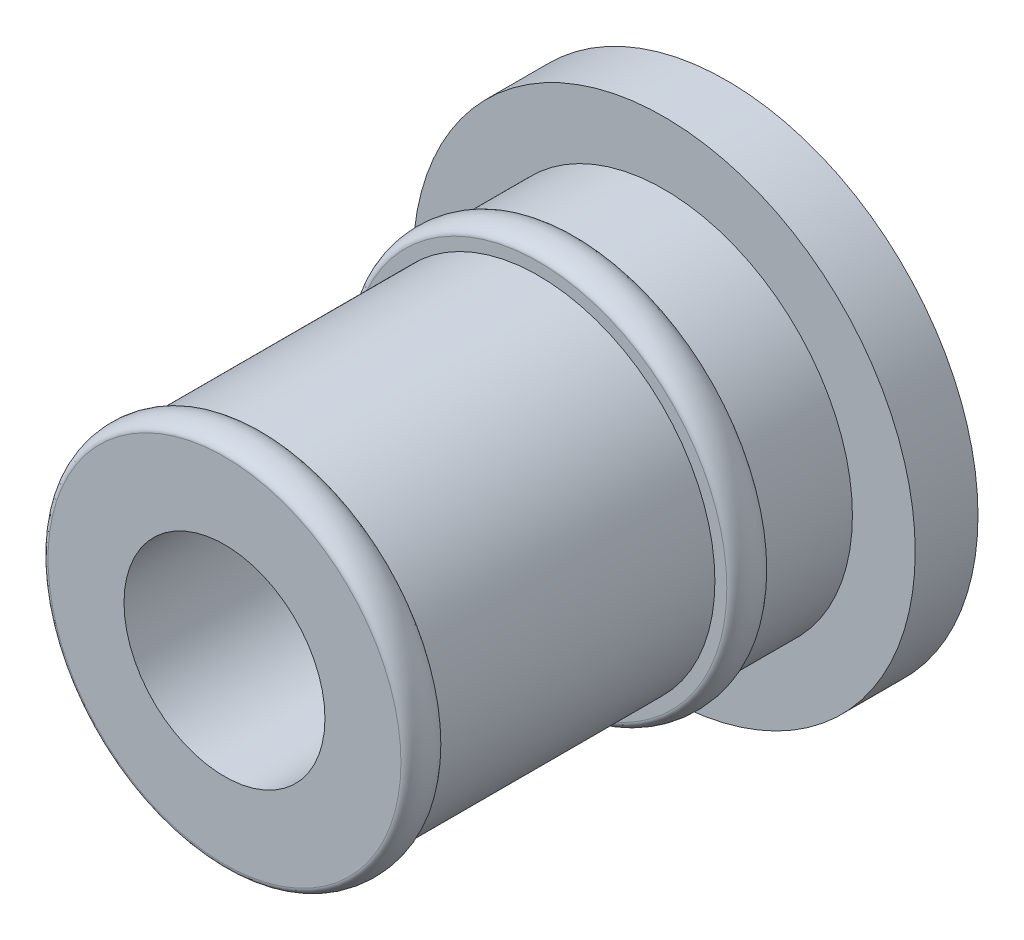
ISO-10303-21;
HEADER;
FILE_DESCRIPTION(('STEP AP214'),'2;1');
FILE_NAME('part.step','',(''),(''),'','','');
FILE_SCHEMA(('AUTOMOTIVE_DESIGN { 1 0 10303 214 1 1 1 1 }'));
ENDSEC;
DATA;
#1=APPLICATION_CONTEXT('core data for automotive mechanical design processes');
#2=APPLICATION_PROTOCOL_DEFINITION('international standard','automotive_design',2000,#1);
#3=PRODUCT_CONTEXT('',#1,'mechanical');
#4=PRODUCT('Part','Part','',(#3));
#5=PRODUCT_RELATED_PRODUCT_CATEGORY('part','',(#4));
#6=PRODUCT_DEFINITION_FORMATION('','',#4);
#7=PRODUCT_DEFINITION_CONTEXT('part definition',#1,'design');
#8=PRODUCT_DEFINITION('design','',#6,#7);
#9=PRODUCT_DEFINITION_SHAPE('','',#8);
#10=(LENGTH_UNIT() NAMED_UNIT(*) SI_UNIT(.MILLI.,.METRE.));
#11=(NAMED_UNIT(*) PLANE_ANGLE_UNIT() SI_UNIT($,.RADIAN.));
#12=(NAMED_UNIT(*) SI_UNIT($,.STERADIAN.) SOLID_ANGLE_UNIT());
#13=UNCERTAINTY_MEASURE_WITH_UNIT(LENGTH_MEASURE(1.E-05),#10,'distance_accuracy_value','');
#14=(GEOMETRIC_REPRESENTATION_CONTEXT(3) GLOBAL_UNCERTAINTY_ASSIGNED_CONTEXT((#13)) GLOBAL_UNIT_ASSIGNED_CONTEXT((#10,
#11,#12)) REPRESENTATION_CONTEXT('',''));
#15=CARTESIAN_POINT('',(0.,0.,0.));
#16=DIRECTION('',(0.,0.,1.));
#17=DIRECTION('',(1.,0.,0.));
#18=AXIS2_PLACEMENT_3D('',#15,#16,#17);
#19=CARTESIAN_POINT('',(0.,0.,8.));
#20=DIRECTION('',(0.,0.,1.));
#21=DIRECTION('',(1.,0.,0.));
#22=AXIS2_PLACEMENT_3D('',#19,#20,#21);
#23=PLANE('',#22);
#24=CARTESIAN_POINT('',(0.,0.,8.));
#25=DIRECTION('',(0.,0.,1.));
#26=DIRECTION('',(1.,0.,0.));
#27=AXIS2_PLACEMENT_3D('',#24,#25,#26);
#28=CIRCLE('',#27,1.6);
#29=CARTESIAN_POINT('',(1.6,0.,8.));
#30=VERTEX_POINT('',#29);
#31=EDGE_CURVE('E45',#30,#30,#28,.T.);
#32=ORIENTED_EDGE('',*,*,#31,.F.);
#33=EDGE_LOOP('',(#32));
#34=FACE_BOUND('',#33,.T.);
#35=CARTESIAN_POINT('',(0.,0.,8.));
#36=DIRECTION('',(0.,0.,1.));
#37=DIRECTION('',(1.,0.,0.));
#38=AXIS2_PLACEMENT_3D('',#35,#36,#37);
#39=CIRCLE('',#38,2.81);
#40=CARTESIAN_POINT('',(2.81,0.,8.));
#41=VERTEX_POINT('',#40);
#42=EDGE_CURVE('E61',#41,#41,#39,.T.);
#43=ORIENTED_EDGE('',*,*,#42,.T.);
#44=EDGE_LOOP('',(#43));
#45=FACE_BOUND('',#44,.T.);
#46=ADVANCED_FACE('F37',(#34,#45),#23,.T.);
#47=CARTESIAN_POINT('',(0.,0.,8.));
#48=DIRECTION('',(0.,0.,-1.));
#49=DIRECTION('',(-1.,0.,0.));
#50=AXIS2_PLACEMENT_3D('',#47,#48,#49);
#51=CYLINDRICAL_SURFACE('',#50,4.);
#52=CARTESIAN_POINT('',(0.,0.,0.));
#53=DIRECTION('',(0.,0.,1.));
#54=DIRECTION('',(1.,0.,0.));
#55=AXIS2_PLACEMENT_3D('',#52,#53,#54);
#56=CIRCLE('',#55,4.);
#57=CARTESIAN_POINT('',(4.,0.,0.));
#58=VERTEX_POINT('',#57);
#59=EDGE_CURVE('E10',#58,#58,#56,.T.);
#60=ORIENTED_EDGE('',*,*,#59,.T.);
#61=EDGE_LOOP('',(#60));
#62=FACE_BOUND('',#61,.T.);
#63=CARTESIAN_POINT('',(0.,0.,1.));
#64=DIRECTION('',(0.,0.,1.));
#65=DIRECTION('',(1.,0.,0.));
#66=AXIS2_PLACEMENT_3D('',#63,#64,#65);
#67=CIRCLE('',#66,4.);
#68=CARTESIAN_POINT('',(4.,0.,1.));
#69=VERTEX_POINT('',#68);
#70=EDGE_CURVE('E56',#69,#69,#67,.T.);
#71=ORIENTED_EDGE('',*,*,#70,.F.);
#72=EDGE_LOOP('',(#71));
#73=FACE_BOUND('',#72,.T.);
#74=ADVANCED_FACE('F39',(#62,#73),#51,.T.);
#75=CARTESIAN_POINT('',(0.,0.,0.));
#76=DIRECTION('',(0.,0.,1.));
#77=DIRECTION('',(1.,0.,0.));
#78=AXIS2_PLACEMENT_3D('',#75,#76,#77);
#79=PLANE('',#78);
#80=ORIENTED_EDGE('',*,*,#59,.F.);
#81=EDGE_LOOP('',(#80));
#82=FACE_BOUND('',#81,.T.);
#83=CARTESIAN_POINT('',(0.,0.,0.));
#84=DIRECTION('',(0.,0.,1.));
#85=DIRECTION('',(1.,0.,0.));
#86=AXIS2_PLACEMENT_3D('',#83,#84,#85);
#87=CIRCLE('',#86,1.6);
#88=CARTESIAN_POINT('',(1.6,0.,0.));
#89=VERTEX_POINT('',#88);
#90=EDGE_CURVE('E50',#89,#89,#87,.T.);
#91=ORIENTED_EDGE('',*,*,#90,.T.);
#92=EDGE_LOOP('',(#91));
#93=FACE_BOUND('',#92,.T.);
#94=ADVANCED_FACE('F114',(#82,#93),#79,.F.);
#95=CARTESIAN_POINT('',(0.,0.,8.));
#96=DIRECTION('',(0.,0.,-1.));
#97=DIRECTION('',(-1.,0.,0.));
#98=AXIS2_PLACEMENT_3D('',#95,#96,#97);
#99=CYLINDRICAL_SURFACE('',#98,1.6);
#100=ORIENTED_EDGE('',*,*,#31,.T.);
#101=EDGE_LOOP('',(#100));
#102=FACE_BOUND('',#101,.T.);
#103=ORIENTED_EDGE('',*,*,#90,.F.);
#104=EDGE_LOOP('',(#103));
#105=FACE_BOUND('',#104,.T.);
#106=ADVANCED_FACE('F110',(#102,#105),#99,.F.);
#107=CARTESIAN_POINT('',(0.,4.,1.));
#108=DIRECTION('',(0.,0.,1.));
#109=DIRECTION('',(1.,0.,0.));
#110=AXIS2_PLACEMENT_3D('',#107,#108,#109);
#111=PLANE('',#110);
#112=ORIENTED_EDGE('',*,*,#70,.T.);
#113=EDGE_LOOP('',(#112));
#114=FACE_BOUND('',#113,.T.);
#115=CARTESIAN_POINT('',(0.,0.,1.));
#116=DIRECTION('',(0.,0.,1.));
#117=DIRECTION('',(1.,0.,0.));
#118=AXIS2_PLACEMENT_3D('',#115,#116,#117);
#119=CIRCLE('',#118,3.);
#120=CARTESIAN_POINT('',(3.,0.,1.));
#121=VERTEX_POINT('',#120);
#122=EDGE_CURVE('E81',#121,#121,#119,.T.);
#123=ORIENTED_EDGE('',*,*,#122,.F.);
#124=EDGE_LOOP('',(#123));
#125=FACE_BOUND('',#124,.T.);
#126=ADVANCED_FACE('F106',(#114,#125),#111,.T.);
#127=CARTESIAN_POINT('',(0.,2.81,7.7));
#128=DIRECTION('',(-1.,0.,0.));
#129=DIRECTION('',(0.,0.,-1.));
#130=AXIS2_PLACEMENT_3D('',#127,#128,#129);
#131=ELLIPSE('',#130,0.3,0.15);
#132=CARTESIAN_POINT('',(0.,0.,8.));
#133=DIRECTION('',(0.,0.,1.));
#134=AXIS1_PLACEMENT('',#132,#133);
#135=SURFACE_OF_REVOLUTION('',#131,#134);
#136=CARTESIAN_POINT('',(0.,0.,7.4));
#137=DIRECTION('',(0.,0.,1.));
#138=DIRECTION('',(1.,0.,0.));
#139=AXIS2_PLACEMENT_3D('',#136,#137,#138);
#140=CIRCLE('',#139,2.81);
#141=CARTESIAN_POINT('',(2.81,0.,7.4));
#142=VERTEX_POINT('',#141);
#143=EDGE_CURVE('E65',#142,#142,#140,.T.);
#144=ORIENTED_EDGE('',*,*,#143,.T.);
#145=EDGE_LOOP('',(#144));
#146=FACE_BOUND('',#145,.T.);
#147=ORIENTED_EDGE('',*,*,#42,.F.);
#148=EDGE_LOOP('',(#147));
#149=FACE_BOUND('',#148,.T.);
#150=ADVANCED_FACE('F102',(#146,#149),#135,.F.);
#151=CARTESIAN_POINT('',(0.,0.,8.));
#152=DIRECTION('',(0.,0.,1.));
#153=DIRECTION('',(1.,0.,0.));
#154=AXIS2_PLACEMENT_3D('',#151,#152,#153);
#155=CYLINDRICAL_SURFACE('',#154,2.81);
#156=CARTESIAN_POINT('',(0.,0.,3.));
#157=DIRECTION('',(0.,0.,1.));
#158=DIRECTION('',(1.,0.,0.));
#159=AXIS2_PLACEMENT_3D('',#156,#157,#158);
#160=CIRCLE('',#159,2.81);
#161=CARTESIAN_POINT('',(2.81,0.,3.));
#162=VERTEX_POINT('',#161);
#163=EDGE_CURVE('E69',#162,#162,#160,.T.);
#164=ORIENTED_EDGE('',*,*,#163,.T.);
#165=EDGE_LOOP('',(#164));
#166=FACE_BOUND('',#165,.T.);
#167=ORIENTED_EDGE('',*,*,#143,.F.);
#168=EDGE_LOOP('',(#167));
#169=FACE_BOUND('',#168,.T.);
#170=ADVANCED_FACE('F98',(#166,#169),#155,.T.);
#171=CARTESIAN_POINT('',(0.,2.81,3.));
#172=DIRECTION('',(0.,0.,1.));
#173=DIRECTION('',(1.,0.,0.));
#174=AXIS2_PLACEMENT_3D('',#171,#172,#173);
#175=PLANE('',#174);
#176=CARTESIAN_POINT('',(0.,0.,3.));
#177=DIRECTION('',(0.,0.,1.));
#178=DIRECTION('',(1.,0.,0.));
#179=AXIS2_PLACEMENT_3D('',#176,#177,#178);
#180=CIRCLE('',#179,3.);
#181=CARTESIAN_POINT('',(3.,0.,3.));
#182=VERTEX_POINT('',#181);
#183=EDGE_CURVE('E73',#182,#182,#180,.T.);
#184=ORIENTED_EDGE('',*,*,#183,.T.);
#185=EDGE_LOOP('',(#184));
#186=FACE_BOUND('',#185,.T.);
#187=ORIENTED_EDGE('',*,*,#163,.F.);
#188=EDGE_LOOP('',(#187));
#189=FACE_BOUND('',#188,.T.);
#190=ADVANCED_FACE('F94',(#186,#189),#175,.T.);
#191=CARTESIAN_POINT('',(0.,3.,2.7));
#192=DIRECTION('',(-1.,0.,0.));
#193=DIRECTION('',(0.,0.,-1.));
#194=AXIS2_PLACEMENT_3D('',#191,#192,#193);
#195=ELLIPSE('',#194,0.3,0.15);
#196=CARTESIAN_POINT('',(0.,0.,8.));
#197=DIRECTION('',(0.,0.,1.));
#198=AXIS1_PLACEMENT('',#196,#197);
#199=SURFACE_OF_REVOLUTION('',#195,#198);
#200=CARTESIAN_POINT('',(0.,0.,2.4));
#201=DIRECTION('',(0.,0.,1.));
#202=DIRECTION('',(1.,0.,0.));
#203=AXIS2_PLACEMENT_3D('',#200,#201,#202);
#204=CIRCLE('',#203,3.);
#205=CARTESIAN_POINT('',(3.,0.,2.4));
#206=VERTEX_POINT('',#205);
#207=EDGE_CURVE('E77',#206,#206,#204,.T.);
#208=ORIENTED_EDGE('',*,*,#207,.T.);
#209=EDGE_LOOP('',(#208));
#210=FACE_BOUND('',#209,.T.);
#211=ORIENTED_EDGE('',*,*,#183,.F.);
#212=EDGE_LOOP('',(#211));
#213=FACE_BOUND('',#212,.T.);
#214=ADVANCED_FACE('F89',(#210,#213),#199,.F.);
#215=CARTESIAN_POINT('',(0.,0.,8.));
#216=DIRECTION('',(0.,0.,1.));
#217=DIRECTION('',(1.,0.,0.));
#218=AXIS2_PLACEMENT_3D('',#215,#216,#217);
#219=CYLINDRICAL_SURFACE('',#218,3.);
#220=ORIENTED_EDGE('',*,*,#122,.T.);
#221=EDGE_LOOP('',(#220));
#222=FACE_BOUND('',#221,.T.);
#223=ORIENTED_EDGE('',*,*,#207,.F.);
#224=EDGE_LOOP('',(#223));
#225=FACE_BOUND('',#224,.T.);
#226=ADVANCED_FACE('F93',(#222,#225),#219,.T.);
#227=CLOSED_SHELL('',(#46,#74,#94,#106,#126,#150,#170,#190,#214,#226));
#228=MANIFOLD_SOLID_BREP('B2',#227);
#229=ADVANCED_BREP_SHAPE_REPRESENTATION('',(#18,#228),#14);
#230=SHAPE_DEFINITION_REPRESENTATION(#9,#229);
ENDSEC;
END-ISO-10303-21;
